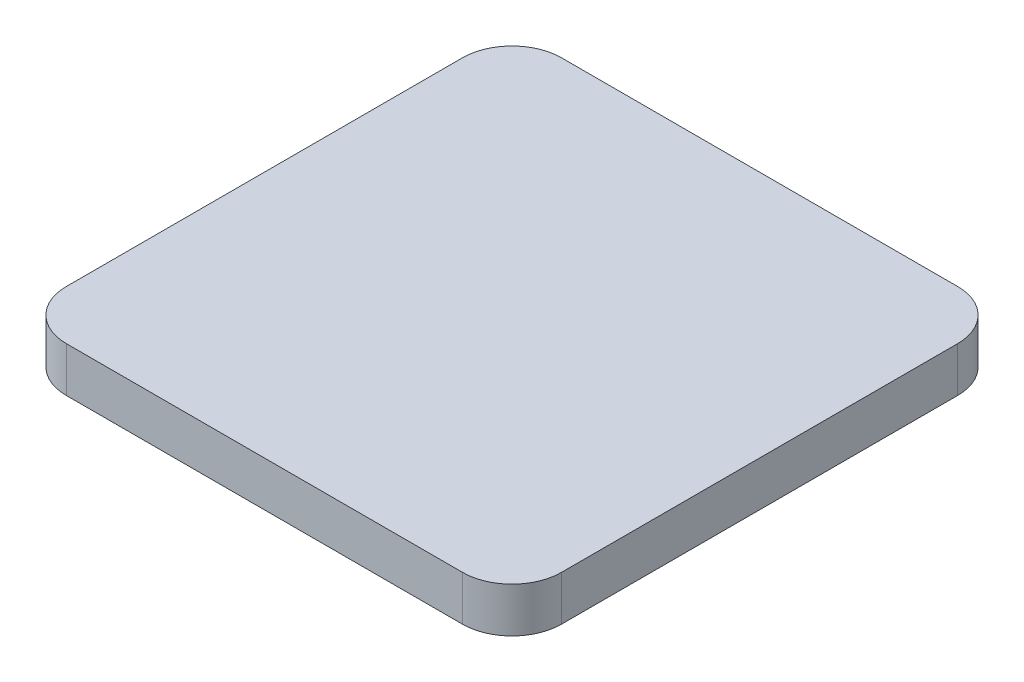
ISO-10303-21;
HEADER;
FILE_DESCRIPTION(('STEP AP214'),'2;1');
FILE_NAME('part.step','',(''),(''),'','','');
FILE_SCHEMA(('AUTOMOTIVE_DESIGN { 1 0 10303 214 1 1 1 1 }'));
ENDSEC;
DATA;
#1=APPLICATION_CONTEXT('core data for automotive mechanical design processes');
#2=APPLICATION_PROTOCOL_DEFINITION('international standard','automotive_design',2000,#1);
#3=PRODUCT_CONTEXT('',#1,'mechanical');
#4=PRODUCT('Part','Part','',(#3));
#5=PRODUCT_RELATED_PRODUCT_CATEGORY('part','',(#4));
#6=PRODUCT_DEFINITION_FORMATION('','',#4);
#7=PRODUCT_DEFINITION_CONTEXT('part definition',#1,'design');
#8=PRODUCT_DEFINITION('design','',#6,#7);
#9=PRODUCT_DEFINITION_SHAPE('','',#8);
#10=(LENGTH_UNIT() NAMED_UNIT(*) SI_UNIT(.MILLI.,.METRE.));
#11=(NAMED_UNIT(*) PLANE_ANGLE_UNIT() SI_UNIT($,.RADIAN.));
#12=(NAMED_UNIT(*) SI_UNIT($,.STERADIAN.) SOLID_ANGLE_UNIT());
#13=UNCERTAINTY_MEASURE_WITH_UNIT(LENGTH_MEASURE(1.E-05),#10,'distance_accuracy_value','');
#14=(GEOMETRIC_REPRESENTATION_CONTEXT(3) GLOBAL_UNCERTAINTY_ASSIGNED_CONTEXT((#13)) GLOBAL_UNIT_ASSIGNED_CONTEXT((#10,
#11,#12)) REPRESENTATION_CONTEXT('',''));
#15=CARTESIAN_POINT('',(0.,0.,0.));
#16=DIRECTION('',(0.,0.,1.));
#17=DIRECTION('',(1.,0.,0.));
#18=AXIS2_PLACEMENT_3D('',#15,#16,#17);
#19=CARTESIAN_POINT('',(0.,6.35,0.));
#20=DIRECTION('',(1.,0.,0.));
#21=DIRECTION('',(0.,0.,-1.));
#22=AXIS2_PLACEMENT_3D('',#19,#20,#21);
#23=PLANE('',#22);
#24=DIRECTION('',(0.,0.,1.));
#25=VECTOR('',#24,1.);
#26=CARTESIAN_POINT('',(0.,0.,0.));
#27=LINE('',#26,#25);
#28=CARTESIAN_POINT('',(0.,0.,-63.));
#29=VERTEX_POINT('',#28);
#30=CARTESIAN_POINT('',(0.,0.,-7.));
#31=VERTEX_POINT('',#30);
#32=EDGE_CURVE('E182',#29,#31,#27,.T.);
#33=ORIENTED_EDGE('',*,*,#32,.T.);
#34=DIRECTION('',(0.,-1.,0.));
#35=VECTOR('',#34,1.);
#36=CARTESIAN_POINT('',(0.,6.35,-7.));
#37=LINE('',#36,#35);
#38=CARTESIAN_POINT('',(0.,6.35,-7.));
#39=VERTEX_POINT('',#38);
#40=EDGE_CURVE('E11',#31,#39,#37,.F.);
#41=ORIENTED_EDGE('',*,*,#40,.T.);
#42=DIRECTION('',(0.,0.,1.));
#43=VECTOR('',#42,1.);
#44=CARTESIAN_POINT('',(0.,6.35,0.));
#45=LINE('',#44,#43);
#46=CARTESIAN_POINT('',(0.,6.35,-63.));
#47=VERTEX_POINT('',#46);
#48=EDGE_CURVE('E135',#47,#39,#45,.T.);
#49=ORIENTED_EDGE('',*,*,#48,.F.);
#50=DIRECTION('',(0.,-1.,0.));
#51=VECTOR('',#50,1.);
#52=CARTESIAN_POINT('',(0.,6.35,-63.));
#53=LINE('',#52,#51);
#54=EDGE_CURVE('E48',#47,#29,#53,.T.);
#55=ORIENTED_EDGE('',*,*,#54,.T.);
#56=EDGE_LOOP('',(#33,#41,#49,#55));
#57=FACE_BOUND('',#56,.T.);
#58=ADVANCED_FACE('F39',(#57),#23,.F.);
#59=CARTESIAN_POINT('',(0.,6.35,0.));
#60=DIRECTION('',(0.,0.,-1.));
#61=DIRECTION('',(-1.,0.,0.));
#62=AXIS2_PLACEMENT_3D('',#59,#60,#61);
#63=PLANE('',#62);
#64=DIRECTION('',(1.,0.,0.));
#65=VECTOR('',#64,1.);
#66=CARTESIAN_POINT('',(0.,0.,0.));
#67=LINE('',#66,#65);
#68=CARTESIAN_POINT('',(7.,0.,0.));
#69=VERTEX_POINT('',#68);
#70=CARTESIAN_POINT('',(63.,0.,0.));
#71=VERTEX_POINT('',#70);
#72=EDGE_CURVE('E142',#69,#71,#67,.T.);
#73=ORIENTED_EDGE('',*,*,#72,.T.);
#74=DIRECTION('',(0.,-1.,0.));
#75=VECTOR('',#74,1.);
#76=CARTESIAN_POINT('',(63.,6.35,0.));
#77=LINE('',#76,#75);
#78=CARTESIAN_POINT('',(63.,6.35,0.));
#79=VERTEX_POINT('',#78);
#80=EDGE_CURVE('E55',#71,#79,#77,.F.);
#81=ORIENTED_EDGE('',*,*,#80,.T.);
#82=DIRECTION('',(1.,0.,0.));
#83=VECTOR('',#82,1.);
#84=CARTESIAN_POINT('',(0.,6.35,0.));
#85=LINE('',#84,#83);
#86=CARTESIAN_POINT('',(7.,6.35,0.));
#87=VERTEX_POINT('',#86);
#88=EDGE_CURVE('E140',#87,#79,#85,.T.);
#89=ORIENTED_EDGE('',*,*,#88,.F.);
#90=DIRECTION('',(0.,-1.,0.));
#91=VECTOR('',#90,1.);
#92=CARTESIAN_POINT('',(7.,6.35,0.));
#93=LINE('',#92,#91);
#94=EDGE_CURVE('E171',#87,#69,#93,.T.);
#95=ORIENTED_EDGE('',*,*,#94,.T.);
#96=EDGE_LOOP('',(#73,#81,#89,#95));
#97=FACE_BOUND('',#96,.T.);
#98=ADVANCED_FACE('F207',(#97),#63,.F.);
#99=CARTESIAN_POINT('',(70.,6.35,0.));
#100=DIRECTION('',(-1.,0.,0.));
#101=DIRECTION('',(0.,0.,1.));
#102=AXIS2_PLACEMENT_3D('',#99,#100,#101);
#103=PLANE('',#102);
#104=DIRECTION('',(0.,0.,-1.));
#105=VECTOR('',#104,1.);
#106=CARTESIAN_POINT('',(70.,0.,0.));
#107=LINE('',#106,#105);
#108=CARTESIAN_POINT('',(70.,0.,-7.));
#109=VERTEX_POINT('',#108);
#110=CARTESIAN_POINT('',(70.,0.,-63.));
#111=VERTEX_POINT('',#110);
#112=EDGE_CURVE('E136',#109,#111,#107,.T.);
#113=ORIENTED_EDGE('',*,*,#112,.T.);
#114=DIRECTION('',(0.,-1.,0.));
#115=VECTOR('',#114,1.);
#116=CARTESIAN_POINT('',(70.,6.35,-63.));
#117=LINE('',#116,#115);
#118=CARTESIAN_POINT('',(70.,6.35,-63.));
#119=VERTEX_POINT('',#118);
#120=EDGE_CURVE('E111',#111,#119,#117,.F.);
#121=ORIENTED_EDGE('',*,*,#120,.T.);
#122=DIRECTION('',(0.,0.,-1.));
#123=VECTOR('',#122,1.);
#124=CARTESIAN_POINT('',(70.,6.35,0.));
#125=LINE('',#124,#123);
#126=CARTESIAN_POINT('',(70.,6.35,-7.));
#127=VERTEX_POINT('',#126);
#128=EDGE_CURVE('E193',#127,#119,#125,.T.);
#129=ORIENTED_EDGE('',*,*,#128,.F.);
#130=DIRECTION('',(0.,-1.,0.));
#131=VECTOR('',#130,1.);
#132=CARTESIAN_POINT('',(70.,6.35,-7.));
#133=LINE('',#132,#131);
#134=EDGE_CURVE('E117',#127,#109,#133,.T.);
#135=ORIENTED_EDGE('',*,*,#134,.T.);
#136=EDGE_LOOP('',(#113,#121,#129,#135));
#137=FACE_BOUND('',#136,.T.);
#138=ADVANCED_FACE('F206',(#137),#103,.F.);
#139=CARTESIAN_POINT('',(0.,6.35,-70.));
#140=DIRECTION('',(0.,0.,1.));
#141=DIRECTION('',(1.,0.,0.));
#142=AXIS2_PLACEMENT_3D('',#139,#140,#141);
#143=PLANE('',#142);
#144=DIRECTION('',(-1.,0.,0.));
#145=VECTOR('',#144,1.);
#146=CARTESIAN_POINT('',(0.,6.35,-70.));
#147=LINE('',#146,#145);
#148=CARTESIAN_POINT('',(63.,6.35,-70.));
#149=VERTEX_POINT('',#148);
#150=CARTESIAN_POINT('',(6.99999999999998,6.35,-70.));
#151=VERTEX_POINT('',#150);
#152=EDGE_CURVE('E127',#149,#151,#147,.T.);
#153=ORIENTED_EDGE('',*,*,#152,.F.);
#154=DIRECTION('',(0.,-1.,0.));
#155=VECTOR('',#154,1.);
#156=CARTESIAN_POINT('',(63.,6.35,-70.));
#157=LINE('',#156,#155);
#158=CARTESIAN_POINT('',(63.,0.,-70.));
#159=VERTEX_POINT('',#158);
#160=EDGE_CURVE('E110',#149,#159,#157,.T.);
#161=ORIENTED_EDGE('',*,*,#160,.T.);
#162=DIRECTION('',(-1.,0.,0.));
#163=VECTOR('',#162,1.);
#164=CARTESIAN_POINT('',(0.,0.,-70.));
#165=LINE('',#164,#163);
#166=CARTESIAN_POINT('',(6.99999999999998,0.,-70.));
#167=VERTEX_POINT('',#166);
#168=EDGE_CURVE('E124',#159,#167,#165,.T.);
#169=ORIENTED_EDGE('',*,*,#168,.T.);
#170=DIRECTION('',(0.,-1.,0.));
#171=VECTOR('',#170,1.);
#172=CARTESIAN_POINT('',(6.99999999999998,6.35,-70.));
#173=LINE('',#172,#171);
#174=EDGE_CURVE('E130',#167,#151,#173,.F.);
#175=ORIENTED_EDGE('',*,*,#174,.T.);
#176=EDGE_LOOP('',(#153,#161,#169,#175));
#177=FACE_BOUND('',#176,.T.);
#178=ADVANCED_FACE('F123',(#177),#143,.F.);
#179=CARTESIAN_POINT('',(0.,6.35,0.));
#180=DIRECTION('',(0.,-1.,0.));
#181=DIRECTION('',(0.,0.,-1.));
#182=AXIS2_PLACEMENT_3D('',#179,#180,#181);
#183=PLANE('',#182);
#184=ORIENTED_EDGE('',*,*,#128,.T.);
#185=CARTESIAN_POINT('',(63.,6.35,-63.));
#186=DIRECTION('',(0.,-1.,0.));
#187=DIRECTION('',(0.,0.,-1.));
#188=AXIS2_PLACEMENT_3D('',#185,#186,#187);
#189=CIRCLE('',#188,7.);
#190=EDGE_CURVE('E168',#119,#149,#189,.F.);
#191=ORIENTED_EDGE('',*,*,#190,.T.);
#192=ORIENTED_EDGE('',*,*,#152,.T.);
#193=CARTESIAN_POINT('',(6.99999999999998,6.35,-63.));
#194=DIRECTION('',(0.,-1.,0.));
#195=DIRECTION('',(0.,0.,-1.));
#196=AXIS2_PLACEMENT_3D('',#193,#194,#195);
#197=CIRCLE('',#196,7.);
#198=EDGE_CURVE('E160',#151,#47,#197,.F.);
#199=ORIENTED_EDGE('',*,*,#198,.T.);
#200=ORIENTED_EDGE('',*,*,#48,.T.);
#201=CARTESIAN_POINT('',(7.,6.35,-7.));
#202=DIRECTION('',(0.,-1.,0.));
#203=DIRECTION('',(0.,0.,-1.));
#204=AXIS2_PLACEMENT_3D('',#201,#202,#203);
#205=CIRCLE('',#204,7.);
#206=EDGE_CURVE('E62',#39,#87,#205,.F.);
#207=ORIENTED_EDGE('',*,*,#206,.T.);
#208=ORIENTED_EDGE('',*,*,#88,.T.);
#209=CARTESIAN_POINT('',(63.,6.35,-7.));
#210=DIRECTION('',(0.,-1.,0.));
#211=DIRECTION('',(0.,0.,-1.));
#212=AXIS2_PLACEMENT_3D('',#209,#210,#211);
#213=CIRCLE('',#212,7.);
#214=EDGE_CURVE('E165',#79,#127,#213,.F.);
#215=ORIENTED_EDGE('',*,*,#214,.T.);
#216=EDGE_LOOP('',(#184,#191,#192,#199,#200,#207,#208,#215));
#217=FACE_BOUND('',#216,.T.);
#218=ADVANCED_FACE('F199',(#217),#183,.F.);
#219=CARTESIAN_POINT('',(0.,0.,0.));
#220=DIRECTION('',(0.,-1.,0.));
#221=DIRECTION('',(0.,0.,-1.));
#222=AXIS2_PLACEMENT_3D('',#219,#220,#221);
#223=PLANE('',#222);
#224=ORIENTED_EDGE('',*,*,#168,.F.);
#225=CARTESIAN_POINT('',(63.,0.,-63.));
#226=DIRECTION('',(0.,-1.,0.));
#227=DIRECTION('',(0.,0.,-1.));
#228=AXIS2_PLACEMENT_3D('',#225,#226,#227);
#229=CIRCLE('',#228,7.);
#230=EDGE_CURVE('E106',#159,#111,#229,.T.);
#231=ORIENTED_EDGE('',*,*,#230,.T.);
#232=ORIENTED_EDGE('',*,*,#112,.F.);
#233=CARTESIAN_POINT('',(63.,0.,-7.));
#234=DIRECTION('',(0.,-1.,0.));
#235=DIRECTION('',(0.,0.,-1.));
#236=AXIS2_PLACEMENT_3D('',#233,#234,#235);
#237=CIRCLE('',#236,7.);
#238=EDGE_CURVE('E118',#109,#71,#237,.T.);
#239=ORIENTED_EDGE('',*,*,#238,.T.);
#240=ORIENTED_EDGE('',*,*,#72,.F.);
#241=CARTESIAN_POINT('',(7.,0.,-7.));
#242=DIRECTION('',(0.,-1.,0.));
#243=DIRECTION('',(0.,0.,-1.));
#244=AXIS2_PLACEMENT_3D('',#241,#242,#243);
#245=CIRCLE('',#244,7.);
#246=EDGE_CURVE('E150',#69,#31,#245,.T.);
#247=ORIENTED_EDGE('',*,*,#246,.T.);
#248=ORIENTED_EDGE('',*,*,#32,.F.);
#249=CARTESIAN_POINT('',(6.99999999999998,0.,-63.));
#250=DIRECTION('',(0.,-1.,0.));
#251=DIRECTION('',(0.,0.,-1.));
#252=AXIS2_PLACEMENT_3D('',#249,#250,#251);
#253=CIRCLE('',#252,7.);
#254=EDGE_CURVE('E129',#29,#167,#253,.T.);
#255=ORIENTED_EDGE('',*,*,#254,.T.);
#256=EDGE_LOOP('',(#224,#231,#232,#239,#240,#247,#248,#255));
#257=FACE_BOUND('',#256,.T.);
#258=ADVANCED_FACE('F132',(#257),#223,.T.);
#259=CARTESIAN_POINT('',(63.,6.35,-63.));
#260=DIRECTION('',(0.,-1.,0.));
#261=DIRECTION('',(0.,0.,-1.));
#262=AXIS2_PLACEMENT_3D('',#259,#260,#261);
#263=CYLINDRICAL_SURFACE('',#262,7.);
#264=ORIENTED_EDGE('',*,*,#190,.F.);
#265=ORIENTED_EDGE('',*,*,#120,.F.);
#266=ORIENTED_EDGE('',*,*,#230,.F.);
#267=ORIENTED_EDGE('',*,*,#160,.F.);
#268=EDGE_LOOP('',(#264,#265,#266,#267));
#269=FACE_BOUND('',#268,.T.);
#270=ADVANCED_FACE('F109',(#269),#263,.T.);
#271=CARTESIAN_POINT('',(63.,6.35,-7.));
#272=DIRECTION('',(0.,-1.,0.));
#273=DIRECTION('',(0.,0.,-1.));
#274=AXIS2_PLACEMENT_3D('',#271,#272,#273);
#275=CYLINDRICAL_SURFACE('',#274,7.);
#276=ORIENTED_EDGE('',*,*,#214,.F.);
#277=ORIENTED_EDGE('',*,*,#80,.F.);
#278=ORIENTED_EDGE('',*,*,#238,.F.);
#279=ORIENTED_EDGE('',*,*,#134,.F.);
#280=EDGE_LOOP('',(#276,#277,#278,#279));
#281=FACE_BOUND('',#280,.T.);
#282=ADVANCED_FACE('F204',(#281),#275,.T.);
#283=CARTESIAN_POINT('',(7.,6.35,-7.));
#284=DIRECTION('',(0.,-1.,0.));
#285=DIRECTION('',(0.,0.,-1.));
#286=AXIS2_PLACEMENT_3D('',#283,#284,#285);
#287=CYLINDRICAL_SURFACE('',#286,7.);
#288=ORIENTED_EDGE('',*,*,#206,.F.);
#289=ORIENTED_EDGE('',*,*,#40,.F.);
#290=ORIENTED_EDGE('',*,*,#246,.F.);
#291=ORIENTED_EDGE('',*,*,#94,.F.);
#292=EDGE_LOOP('',(#288,#289,#290,#291));
#293=FACE_BOUND('',#292,.T.);
#294=ADVANCED_FACE('F209',(#293),#287,.T.);
#295=CARTESIAN_POINT('',(6.99999999999998,6.35,-63.));
#296=DIRECTION('',(0.,-1.,0.));
#297=DIRECTION('',(0.,0.,-1.));
#298=AXIS2_PLACEMENT_3D('',#295,#296,#297);
#299=CYLINDRICAL_SURFACE('',#298,7.);
#300=ORIENTED_EDGE('',*,*,#198,.F.);
#301=ORIENTED_EDGE('',*,*,#174,.F.);
#302=ORIENTED_EDGE('',*,*,#254,.F.);
#303=ORIENTED_EDGE('',*,*,#54,.F.);
#304=EDGE_LOOP('',(#300,#301,#302,#303));
#305=FACE_BOUND('',#304,.T.);
#306=ADVANCED_FACE('F41',(#305),#299,.T.);
#307=CLOSED_SHELL('',(#58,#98,#138,#178,#218,#258,#270,#282,#294,#306));
#308=MANIFOLD_SOLID_BREP('B2',#307);
#309=ADVANCED_BREP_SHAPE_REPRESENTATION('',(#18,#308),#14);
#310=SHAPE_DEFINITION_REPRESENTATION(#9,#309);
ENDSEC;
END-ISO-10303-21;
